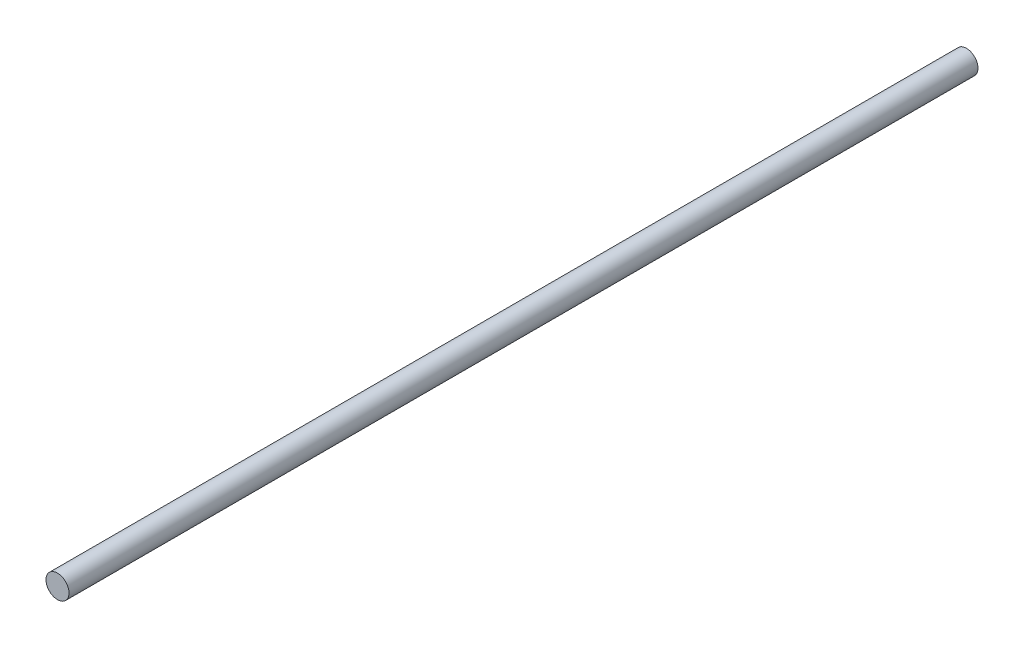
ISO-10303-21;
HEADER;
FILE_DESCRIPTION(('STEP AP214'),'2;1');
FILE_NAME('part.step','',(''),(''),'','','');
FILE_SCHEMA(('AUTOMOTIVE_DESIGN { 1 0 10303 214 1 1 1 1 }'));
ENDSEC;
DATA;
#1=APPLICATION_CONTEXT('core data for automotive mechanical design processes');
#2=APPLICATION_PROTOCOL_DEFINITION('international standard','automotive_design',2000,#1);
#3=PRODUCT_CONTEXT('',#1,'mechanical');
#4=PRODUCT('Part','Part','',(#3));
#5=PRODUCT_RELATED_PRODUCT_CATEGORY('part','',(#4));
#6=PRODUCT_DEFINITION_FORMATION('','',#4);
#7=PRODUCT_DEFINITION_CONTEXT('part definition',#1,'design');
#8=PRODUCT_DEFINITION('design','',#6,#7);
#9=PRODUCT_DEFINITION_SHAPE('','',#8);
#10=(LENGTH_UNIT() NAMED_UNIT(*) SI_UNIT(.MILLI.,.METRE.));
#11=(NAMED_UNIT(*) PLANE_ANGLE_UNIT() SI_UNIT($,.RADIAN.));
#12=(NAMED_UNIT(*) SI_UNIT($,.STERADIAN.) SOLID_ANGLE_UNIT());
#13=UNCERTAINTY_MEASURE_WITH_UNIT(LENGTH_MEASURE(1.E-05),#10,'distance_accuracy_value','');
#14=(GEOMETRIC_REPRESENTATION_CONTEXT(3) GLOBAL_UNCERTAINTY_ASSIGNED_CONTEXT((#13)) GLOBAL_UNIT_ASSIGNED_CONTEXT((#10,
#11,#12)) REPRESENTATION_CONTEXT('',''));
#15=CARTESIAN_POINT('',(0.,0.,0.));
#16=DIRECTION('',(0.,0.,1.));
#17=DIRECTION('',(1.,0.,0.));
#18=AXIS2_PLACEMENT_3D('',#15,#16,#17);
#19=CARTESIAN_POINT('',(0.,0.,355.));
#20=DIRECTION('',(0.,0.,-1.));
#21=DIRECTION('',(-1.,0.,0.));
#22=AXIS2_PLACEMENT_3D('',#19,#20,#21);
#23=CYLINDRICAL_SURFACE('',#22,4.5);
#24=CARTESIAN_POINT('',(0.,0.,355.));
#25=DIRECTION('',(0.,0.,1.));
#26=DIRECTION('',(1.,0.,0.));
#27=AXIS2_PLACEMENT_3D('',#24,#25,#26);
#28=CIRCLE('',#27,4.5);
#29=CARTESIAN_POINT('',(4.5,0.,355.));
#30=VERTEX_POINT('',#29);
#31=EDGE_CURVE('E10',#30,#30,#28,.T.);
#32=ORIENTED_EDGE('',*,*,#31,.F.);
#33=EDGE_LOOP('',(#32));
#34=FACE_BOUND('',#33,.T.);
#35=CARTESIAN_POINT('',(0.,0.,0.));
#36=DIRECTION('',(0.,0.,1.));
#37=DIRECTION('',(1.,0.,0.));
#38=AXIS2_PLACEMENT_3D('',#35,#36,#37);
#39=CIRCLE('',#38,4.5);
#40=CARTESIAN_POINT('',(4.5,0.,0.));
#41=VERTEX_POINT('',#40);
#42=EDGE_CURVE('E42',#41,#41,#39,.T.);
#43=ORIENTED_EDGE('',*,*,#42,.T.);
#44=EDGE_LOOP('',(#43));
#45=FACE_BOUND('',#44,.T.);
#46=ADVANCED_FACE('F39',(#34,#45),#23,.T.);
#47=CARTESIAN_POINT('',(0.,0.,355.));
#48=DIRECTION('',(0.,0.,1.));
#49=DIRECTION('',(1.,0.,0.));
#50=AXIS2_PLACEMENT_3D('',#47,#48,#49);
#51=PLANE('',#50);
#52=ORIENTED_EDGE('',*,*,#31,.T.);
#53=EDGE_LOOP('',(#52));
#54=FACE_BOUND('',#53,.T.);
#55=ADVANCED_FACE('F56',(#54),#51,.T.);
#56=CARTESIAN_POINT('',(0.,0.,0.));
#57=DIRECTION('',(0.,0.,1.));
#58=DIRECTION('',(1.,0.,0.));
#59=AXIS2_PLACEMENT_3D('',#56,#57,#58);
#60=PLANE('',#59);
#61=ORIENTED_EDGE('',*,*,#42,.F.);
#62=EDGE_LOOP('',(#61));
#63=FACE_BOUND('',#62,.T.);
#64=ADVANCED_FACE('F54',(#63),#60,.F.);
#65=CLOSED_SHELL('',(#46,#55,#64));
#66=MANIFOLD_SOLID_BREP('B2',#65);
#67=ADVANCED_BREP_SHAPE_REPRESENTATION('',(#18,#66),#14);
#68=SHAPE_DEFINITION_REPRESENTATION(#9,#67);
ENDSEC;
END-ISO-10303-21;
